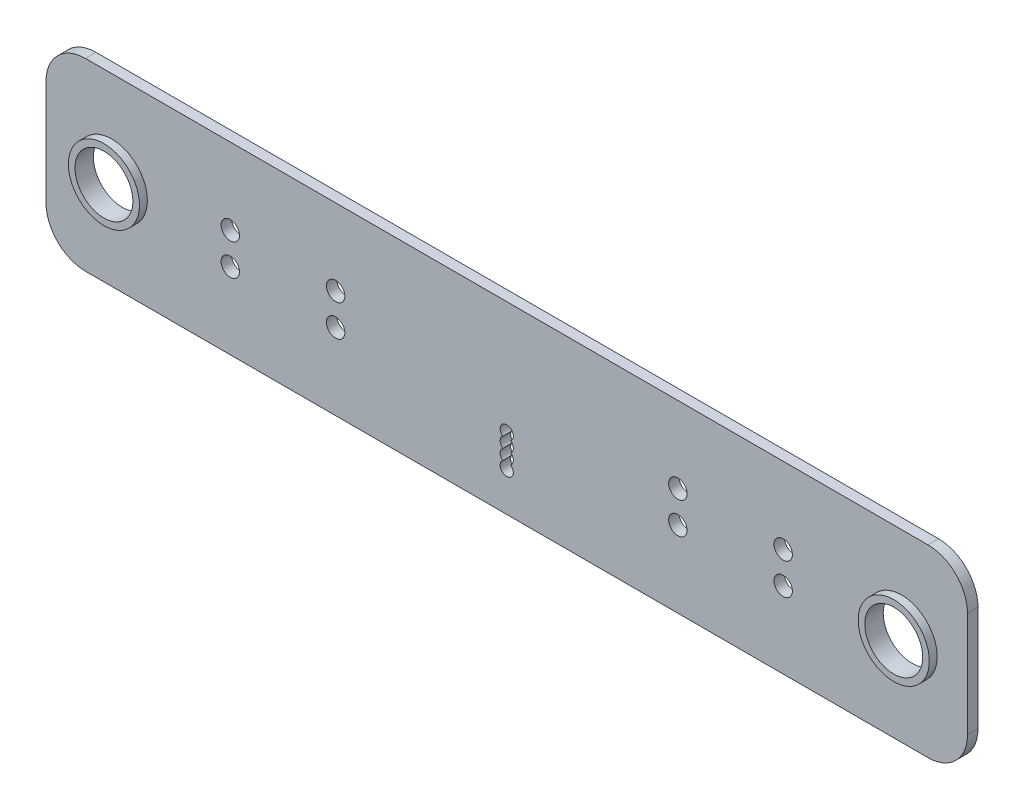
ISO-10303-21;
HEADER;
FILE_DESCRIPTION(('STEP AP214'),'2;1');
FILE_NAME('part.step','',(''),(''),'','','');
FILE_SCHEMA(('AUTOMOTIVE_DESIGN { 1 0 10303 214 1 1 1 1 }'));
ENDSEC;
DATA;
#1=APPLICATION_CONTEXT('core data for automotive mechanical design processes');
#2=APPLICATION_PROTOCOL_DEFINITION('international standard','automotive_design',2000,#1);
#3=PRODUCT_CONTEXT('',#1,'mechanical');
#4=PRODUCT('Part','Part','',(#3));
#5=PRODUCT_RELATED_PRODUCT_CATEGORY('part','',(#4));
#6=PRODUCT_DEFINITION_FORMATION('','',#4);
#7=PRODUCT_DEFINITION_CONTEXT('part definition',#1,'design');
#8=PRODUCT_DEFINITION('design','',#6,#7);
#9=PRODUCT_DEFINITION_SHAPE('','',#8);
#10=(LENGTH_UNIT() NAMED_UNIT(*) SI_UNIT(.MILLI.,.METRE.));
#11=(NAMED_UNIT(*) PLANE_ANGLE_UNIT() SI_UNIT($,.RADIAN.));
#12=(NAMED_UNIT(*) SI_UNIT($,.STERADIAN.) SOLID_ANGLE_UNIT());
#13=UNCERTAINTY_MEASURE_WITH_UNIT(LENGTH_MEASURE(1.E-05),#10,'distance_accuracy_value','');
#14=(GEOMETRIC_REPRESENTATION_CONTEXT(3) GLOBAL_UNCERTAINTY_ASSIGNED_CONTEXT((#13)) GLOBAL_UNIT_ASSIGNED_CONTEXT((#10,
#11,#12)) REPRESENTATION_CONTEXT('',''));
#15=CARTESIAN_POINT('',(0.,0.,0.));
#16=DIRECTION('',(0.,0.,1.));
#17=DIRECTION('',(1.,0.,0.));
#18=AXIS2_PLACEMENT_3D('',#15,#16,#17);
#19=CARTESIAN_POINT('',(0.,0.,4.));
#20=DIRECTION('',(0.,0.,1.));
#21=DIRECTION('',(1.,0.,0.));
#22=AXIS2_PLACEMENT_3D('',#19,#20,#21);
#23=PLANE('',#22);
#24=CARTESIAN_POINT('',(-150.,0.,4.));
#25=DIRECTION('',(0.,0.,1.));
#26=DIRECTION('',(1.,0.,0.));
#27=AXIS2_PLACEMENT_3D('',#24,#25,#26);
#28=CIRCLE('',#27,13.5);
#29=CARTESIAN_POINT('',(-136.5,0.,4.));
#30=VERTEX_POINT('',#29);
#31=EDGE_CURVE('E397',#30,#30,#28,.T.);
#32=ORIENTED_EDGE('',*,*,#31,.F.);
#33=EDGE_LOOP('',(#32));
#34=FACE_BOUND('',#33,.T.);
#35=CARTESIAN_POINT('',(65.,6.,4.));
#36=DIRECTION('',(0.,0.,1.));
#37=DIRECTION('',(-1.,0.,0.));
#38=AXIS2_PLACEMENT_3D('',#35,#36,#37);
#39=CIRCLE('',#38,3.50000000000001);
#40=CARTESIAN_POINT('',(61.5,6.,4.));
#41=VERTEX_POINT('',#40);
#42=EDGE_CURVE('E270',#41,#41,#39,.T.);
#43=ORIENTED_EDGE('',*,*,#42,.F.);
#44=EDGE_LOOP('',(#43));
#45=FACE_BOUND('',#44,.T.);
#46=CARTESIAN_POINT('',(65.,-6.,4.));
#47=DIRECTION('',(0.,0.,1.));
#48=DIRECTION('',(-1.,0.,0.));
#49=AXIS2_PLACEMENT_3D('',#46,#47,#48);
#50=CIRCLE('',#49,3.50000000000001);
#51=CARTESIAN_POINT('',(61.5,-6.,4.));
#52=VERTEX_POINT('',#51);
#53=EDGE_CURVE('E405',#52,#52,#50,.T.);
#54=ORIENTED_EDGE('',*,*,#53,.F.);
#55=EDGE_LOOP('',(#54));
#56=FACE_BOUND('',#55,.T.);
#57=CARTESIAN_POINT('',(105.,-6.,4.));
#58=DIRECTION('',(0.,0.,1.));
#59=DIRECTION('',(-1.,0.,0.));
#60=AXIS2_PLACEMENT_3D('',#57,#58,#59);
#61=CIRCLE('',#60,3.50000000000001);
#62=CARTESIAN_POINT('',(101.5,-6.,4.));
#63=VERTEX_POINT('',#62);
#64=EDGE_CURVE('E408',#63,#63,#61,.T.);
#65=ORIENTED_EDGE('',*,*,#64,.F.);
#66=EDGE_LOOP('',(#65));
#67=FACE_BOUND('',#66,.T.);
#68=CARTESIAN_POINT('',(105.,6.,4.));
#69=DIRECTION('',(0.,0.,1.));
#70=DIRECTION('',(-1.,0.,0.));
#71=AXIS2_PLACEMENT_3D('',#68,#69,#70);
#72=CIRCLE('',#71,3.50000000000001);
#73=CARTESIAN_POINT('',(101.5,6.,4.));
#74=VERTEX_POINT('',#73);
#75=EDGE_CURVE('E172',#74,#74,#72,.T.);
#76=ORIENTED_EDGE('',*,*,#75,.F.);
#77=EDGE_LOOP('',(#76));
#78=FACE_BOUND('',#77,.T.);
#79=CARTESIAN_POINT('',(-65.,6.,4.));
#80=DIRECTION('',(0.,0.,1.));
#81=DIRECTION('',(1.,0.,0.));
#82=AXIS2_PLACEMENT_3D('',#79,#80,#81);
#83=CIRCLE('',#82,3.50000000000001);
#84=CARTESIAN_POINT('',(-61.5,6.,4.));
#85=VERTEX_POINT('',#84);
#86=EDGE_CURVE('E401',#85,#85,#83,.T.);
#87=ORIENTED_EDGE('',*,*,#86,.F.);
#88=EDGE_LOOP('',(#87));
#89=FACE_BOUND('',#88,.T.);
#90=CARTESIAN_POINT('',(-65.,-6.,4.));
#91=DIRECTION('',(0.,0.,1.));
#92=DIRECTION('',(1.,0.,0.));
#93=AXIS2_PLACEMENT_3D('',#90,#91,#92);
#94=CIRCLE('',#93,3.50000000000001);
#95=CARTESIAN_POINT('',(-61.5,-6.,4.));
#96=VERTEX_POINT('',#95);
#97=EDGE_CURVE('E182',#96,#96,#94,.T.);
#98=ORIENTED_EDGE('',*,*,#97,.F.);
#99=EDGE_LOOP('',(#98));
#100=FACE_BOUND('',#99,.T.);
#101=CARTESIAN_POINT('',(-105.,-6.,4.));
#102=DIRECTION('',(0.,0.,1.));
#103=DIRECTION('',(1.,0.,0.));
#104=AXIS2_PLACEMENT_3D('',#101,#102,#103);
#105=CIRCLE('',#104,3.50000000000001);
#106=CARTESIAN_POINT('',(-101.5,-6.,4.));
#107=VERTEX_POINT('',#106);
#108=EDGE_CURVE('E179',#107,#107,#105,.T.);
#109=ORIENTED_EDGE('',*,*,#108,.F.);
#110=EDGE_LOOP('',(#109));
#111=FACE_BOUND('',#110,.T.);
#112=CARTESIAN_POINT('',(0.,-16.,4.));
#113=DIRECTION('',(0.,0.,1.));
#114=DIRECTION('',(-1.,0.,0.));
#115=AXIS2_PLACEMENT_3D('',#112,#113,#114);
#116=CIRCLE('',#115,2.5);
#117=CARTESIAN_POINT('',(-1.49999999999994,-14.,4.));
#118=VERTEX_POINT('',#117);
#119=CARTESIAN_POINT('',(-1.49999999999998,-18.,4.));
#120=VERTEX_POINT('',#119);
#121=EDGE_CURVE('E54',#118,#120,#116,.T.);
#122=ORIENTED_EDGE('',*,*,#121,.F.);
#123=CARTESIAN_POINT('',(0.,-12.,4.));
#124=DIRECTION('',(0.,0.,1.));
#125=DIRECTION('',(-1.,0.,0.));
#126=AXIS2_PLACEMENT_3D('',#123,#124,#125);
#127=CIRCLE('',#126,2.5);
#128=CARTESIAN_POINT('',(-1.49999999999989,-9.99999999999998,4.));
#129=VERTEX_POINT('',#128);
#130=EDGE_CURVE('E167',#129,#118,#127,.T.);
#131=ORIENTED_EDGE('',*,*,#130,.F.);
#132=CARTESIAN_POINT('',(1.26305651597926E-13,-8.,4.));
#133=DIRECTION('',(0.,0.,1.));
#134=DIRECTION('',(-1.,0.,0.));
#135=AXIS2_PLACEMENT_3D('',#132,#133,#134);
#136=CIRCLE('',#135,2.5);
#137=CARTESIAN_POINT('',(1.50000000000011,-10.,4.));
#138=VERTEX_POINT('',#137);
#139=EDGE_CURVE('E161',#138,#129,#136,.T.);
#140=ORIENTED_EDGE('',*,*,#139,.F.);
#141=CARTESIAN_POINT('',(0.,-12.,4.));
#142=DIRECTION('',(0.,0.,1.));
#143=DIRECTION('',(-1.,0.,0.));
#144=AXIS2_PLACEMENT_3D('',#141,#142,#143);
#145=CIRCLE('',#144,2.5);
#146=CARTESIAN_POINT('',(1.50000000000006,-14.,4.));
#147=VERTEX_POINT('',#146);
#148=EDGE_CURVE('E159',#147,#138,#145,.T.);
#149=ORIENTED_EDGE('',*,*,#148,.F.);
#150=CARTESIAN_POINT('',(0.,-16.,4.));
#151=DIRECTION('',(0.,0.,1.));
#152=DIRECTION('',(-1.,0.,0.));
#153=AXIS2_PLACEMENT_3D('',#150,#151,#152);
#154=CIRCLE('',#153,2.5);
#155=CARTESIAN_POINT('',(1.50000000000002,-18.,4.));
#156=VERTEX_POINT('',#155);
#157=EDGE_CURVE('E143',#156,#147,#154,.T.);
#158=ORIENTED_EDGE('',*,*,#157,.F.);
#159=CARTESIAN_POINT('',(0.,-20.,4.));
#160=DIRECTION('',(0.,0.,1.));
#161=DIRECTION('',(-1.,0.,0.));
#162=AXIS2_PLACEMENT_3D('',#159,#160,#161);
#163=CIRCLE('',#162,2.5);
#164=EDGE_CURVE('E152',#120,#156,#163,.T.);
#165=ORIENTED_EDGE('',*,*,#164,.F.);
#166=EDGE_LOOP('',(#122,#131,#140,#149,#158,#165));
#167=FACE_BOUND('',#166,.T.);
#168=CARTESIAN_POINT('',(-105.,6.,4.));
#169=DIRECTION('',(0.,0.,1.));
#170=DIRECTION('',(1.,0.,0.));
#171=AXIS2_PLACEMENT_3D('',#168,#169,#170);
#172=CIRCLE('',#171,3.50000000000001);
#173=CARTESIAN_POINT('',(-101.5,6.,4.));
#174=VERTEX_POINT('',#173);
#175=EDGE_CURVE('E183',#174,#174,#172,.T.);
#176=ORIENTED_EDGE('',*,*,#175,.F.);
#177=EDGE_LOOP('',(#176));
#178=FACE_BOUND('',#177,.T.);
#179=DIRECTION('',(1.,0.,0.));
#180=VECTOR('',#179,1.);
#181=CARTESIAN_POINT('',(-175.,-35.,4.));
#182=LINE('',#181,#180);
#183=CARTESIAN_POINT('',(-160.,-35.,4.));
#184=VERTEX_POINT('',#183);
#185=CARTESIAN_POINT('',(160.,-35.,4.));
#186=VERTEX_POINT('',#185);
#187=EDGE_CURVE('E204',#184,#186,#182,.T.);
#188=ORIENTED_EDGE('',*,*,#187,.T.);
#189=CARTESIAN_POINT('',(160.,-20.,4.));
#190=DIRECTION('',(0.,0.,1.));
#191=DIRECTION('',(1.,0.,0.));
#192=AXIS2_PLACEMENT_3D('',#189,#190,#191);
#193=CIRCLE('',#192,15.);
#194=CARTESIAN_POINT('',(175.,-20.,4.));
#195=VERTEX_POINT('',#194);
#196=EDGE_CURVE('E241',#186,#195,#193,.T.);
#197=ORIENTED_EDGE('',*,*,#196,.T.);
#198=DIRECTION('',(0.,1.,0.));
#199=VECTOR('',#198,1.);
#200=CARTESIAN_POINT('',(175.,35.,4.));
#201=LINE('',#200,#199);
#202=CARTESIAN_POINT('',(175.,20.,4.));
#203=VERTEX_POINT('',#202);
#204=EDGE_CURVE('E194',#195,#203,#201,.T.);
#205=ORIENTED_EDGE('',*,*,#204,.T.);
#206=CARTESIAN_POINT('',(160.,20.,4.));
#207=DIRECTION('',(0.,0.,1.));
#208=DIRECTION('',(1.,0.,0.));
#209=AXIS2_PLACEMENT_3D('',#206,#207,#208);
#210=CIRCLE('',#209,15.);
#211=CARTESIAN_POINT('',(160.,35.,4.));
#212=VERTEX_POINT('',#211);
#213=EDGE_CURVE('E239',#203,#212,#210,.T.);
#214=ORIENTED_EDGE('',*,*,#213,.T.);
#215=DIRECTION('',(-1.,0.,0.));
#216=VECTOR('',#215,1.);
#217=CARTESIAN_POINT('',(-175.,35.,4.));
#218=LINE('',#217,#216);
#219=CARTESIAN_POINT('',(-160.,35.,4.));
#220=VERTEX_POINT('',#219);
#221=EDGE_CURVE('E197',#212,#220,#218,.T.);
#222=ORIENTED_EDGE('',*,*,#221,.T.);
#223=CARTESIAN_POINT('',(-160.,20.,4.));
#224=DIRECTION('',(0.,0.,1.));
#225=DIRECTION('',(1.,0.,0.));
#226=AXIS2_PLACEMENT_3D('',#223,#224,#225);
#227=CIRCLE('',#226,15.);
#228=CARTESIAN_POINT('',(-175.,20.,4.));
#229=VERTEX_POINT('',#228);
#230=EDGE_CURVE('E235',#220,#229,#227,.T.);
#231=ORIENTED_EDGE('',*,*,#230,.T.);
#232=DIRECTION('',(0.,-1.,0.));
#233=VECTOR('',#232,1.);
#234=CARTESIAN_POINT('',(-175.,35.,4.));
#235=LINE('',#234,#233);
#236=CARTESIAN_POINT('',(-175.,-20.,4.));
#237=VERTEX_POINT('',#236);
#238=EDGE_CURVE('E201',#229,#237,#235,.T.);
#239=ORIENTED_EDGE('',*,*,#238,.T.);
#240=CARTESIAN_POINT('',(-160.,-20.,4.));
#241=DIRECTION('',(0.,0.,1.));
#242=DIRECTION('',(1.,0.,0.));
#243=AXIS2_PLACEMENT_3D('',#240,#241,#242);
#244=CIRCLE('',#243,15.);
#245=EDGE_CURVE('E237',#237,#184,#244,.T.);
#246=ORIENTED_EDGE('',*,*,#245,.T.);
#247=EDGE_LOOP('',(#188,#197,#205,#214,#222,#231,#239,#246));
#248=FACE_BOUND('',#247,.T.);
#249=CARTESIAN_POINT('',(150.,0.,4.));
#250=DIRECTION('',(0.,0.,1.));
#251=DIRECTION('',(1.,0.,0.));
#252=AXIS2_PLACEMENT_3D('',#249,#250,#251);
#253=CIRCLE('',#252,13.5);
#254=CARTESIAN_POINT('',(163.5,0.,4.));
#255=VERTEX_POINT('',#254);
#256=EDGE_CURVE('E386',#255,#255,#253,.T.);
#257=ORIENTED_EDGE('',*,*,#256,.F.);
#258=EDGE_LOOP('',(#257));
#259=FACE_BOUND('',#258,.T.);
#260=ADVANCED_FACE('F37',(#34,#45,#56,#67,#78,#89,#100,#111,#167,#178,#248,#259),#23,.T.);
#261=CARTESIAN_POINT('',(175.,35.,4.));
#262=DIRECTION('',(-1.,0.,0.));
#263=DIRECTION('',(0.,-1.,0.));
#264=AXIS2_PLACEMENT_3D('',#261,#262,#263);
#265=PLANE('',#264);
#266=ORIENTED_EDGE('',*,*,#204,.F.);
#267=DIRECTION('',(0.,0.,-1.));
#268=VECTOR('',#267,1.);
#269=CARTESIAN_POINT('',(175.,-20.,4.));
#270=LINE('',#269,#268);
#271=CARTESIAN_POINT('',(175.,-20.,0.));
#272=VERTEX_POINT('',#271);
#273=EDGE_CURVE('E219',#195,#272,#270,.T.);
#274=ORIENTED_EDGE('',*,*,#273,.T.);
#275=DIRECTION('',(0.,1.,0.));
#276=VECTOR('',#275,1.);
#277=CARTESIAN_POINT('',(175.,35.,0.));
#278=LINE('',#277,#276);
#279=CARTESIAN_POINT('',(175.,20.,0.));
#280=VERTEX_POINT('',#279);
#281=EDGE_CURVE('E193',#272,#280,#278,.T.);
#282=ORIENTED_EDGE('',*,*,#281,.T.);
#283=DIRECTION('',(0.,0.,-1.));
#284=VECTOR('',#283,1.);
#285=CARTESIAN_POINT('',(175.,20.,4.));
#286=LINE('',#285,#284);
#287=EDGE_CURVE('E207',#280,#203,#286,.F.);
#288=ORIENTED_EDGE('',*,*,#287,.T.);
#289=EDGE_LOOP('',(#266,#274,#282,#288));
#290=FACE_BOUND('',#289,.T.);
#291=ADVANCED_FACE('F309',(#290),#265,.F.);
#292=CARTESIAN_POINT('',(-175.,35.,4.));
#293=DIRECTION('',(0.,-1.,0.));
#294=DIRECTION('',(0.,0.,-1.));
#295=AXIS2_PLACEMENT_3D('',#292,#293,#294);
#296=PLANE('',#295);
#297=ORIENTED_EDGE('',*,*,#221,.F.);
#298=DIRECTION('',(0.,0.,-1.));
#299=VECTOR('',#298,1.);
#300=CARTESIAN_POINT('',(160.,35.,4.));
#301=LINE('',#300,#299);
#302=CARTESIAN_POINT('',(160.,35.,0.));
#303=VERTEX_POINT('',#302);
#304=EDGE_CURVE('E245',#212,#303,#301,.T.);
#305=ORIENTED_EDGE('',*,*,#304,.T.);
#306=DIRECTION('',(-1.,0.,0.));
#307=VECTOR('',#306,1.);
#308=CARTESIAN_POINT('',(-175.,35.,0.));
#309=LINE('',#308,#307);
#310=CARTESIAN_POINT('',(-160.,35.,0.));
#311=VERTEX_POINT('',#310);
#312=EDGE_CURVE('E210',#303,#311,#309,.T.);
#313=ORIENTED_EDGE('',*,*,#312,.T.);
#314=DIRECTION('',(0.,0.,-1.));
#315=VECTOR('',#314,1.);
#316=CARTESIAN_POINT('',(-160.,35.,4.));
#317=LINE('',#316,#315);
#318=EDGE_CURVE('E243',#311,#220,#317,.F.);
#319=ORIENTED_EDGE('',*,*,#318,.T.);
#320=EDGE_LOOP('',(#297,#305,#313,#319));
#321=FACE_BOUND('',#320,.T.);
#322=ADVANCED_FACE('F315',(#321),#296,.F.);
#323=CARTESIAN_POINT('',(-175.,35.,4.));
#324=DIRECTION('',(1.,0.,0.));
#325=DIRECTION('',(0.,0.,-1.));
#326=AXIS2_PLACEMENT_3D('',#323,#324,#325);
#327=PLANE('',#326);
#328=DIRECTION('',(0.,-1.,0.));
#329=VECTOR('',#328,1.);
#330=CARTESIAN_POINT('',(-175.,35.,0.));
#331=LINE('',#330,#329);
#332=CARTESIAN_POINT('',(-175.,20.,0.));
#333=VERTEX_POINT('',#332);
#334=CARTESIAN_POINT('',(-175.,-20.,0.));
#335=VERTEX_POINT('',#334);
#336=EDGE_CURVE('E213',#333,#335,#331,.T.);
#337=ORIENTED_EDGE('',*,*,#336,.T.);
#338=DIRECTION('',(0.,0.,-1.));
#339=VECTOR('',#338,1.);
#340=CARTESIAN_POINT('',(-175.,-20.,4.));
#341=LINE('',#340,#339);
#342=EDGE_CURVE('E251',#335,#237,#341,.F.);
#343=ORIENTED_EDGE('',*,*,#342,.T.);
#344=ORIENTED_EDGE('',*,*,#238,.F.);
#345=DIRECTION('',(0.,0.,-1.));
#346=VECTOR('',#345,1.);
#347=CARTESIAN_POINT('',(-175.,20.,4.));
#348=LINE('',#347,#346);
#349=EDGE_CURVE('E248',#229,#333,#348,.T.);
#350=ORIENTED_EDGE('',*,*,#349,.T.);
#351=EDGE_LOOP('',(#337,#343,#344,#350));
#352=FACE_BOUND('',#351,.T.);
#353=ADVANCED_FACE('F330',(#352),#327,.F.);
#354=CARTESIAN_POINT('',(-175.,-35.,4.));
#355=DIRECTION('',(0.,1.,0.));
#356=DIRECTION('',(0.,0.,1.));
#357=AXIS2_PLACEMENT_3D('',#354,#355,#356);
#358=PLANE('',#357);
#359=DIRECTION('',(1.,0.,0.));
#360=VECTOR('',#359,1.);
#361=CARTESIAN_POINT('',(-175.,-35.,0.));
#362=LINE('',#361,#360);
#363=CARTESIAN_POINT('',(-160.,-35.,0.));
#364=VERTEX_POINT('',#363);
#365=CARTESIAN_POINT('',(160.,-35.,0.));
#366=VERTEX_POINT('',#365);
#367=EDGE_CURVE('E198',#364,#366,#362,.T.);
#368=ORIENTED_EDGE('',*,*,#367,.T.);
#369=DIRECTION('',(0.,0.,-1.));
#370=VECTOR('',#369,1.);
#371=CARTESIAN_POINT('',(160.,-35.,4.));
#372=LINE('',#371,#370);
#373=EDGE_CURVE('E233',#366,#186,#372,.F.);
#374=ORIENTED_EDGE('',*,*,#373,.T.);
#375=ORIENTED_EDGE('',*,*,#187,.F.);
#376=DIRECTION('',(0.,0.,-1.));
#377=VECTOR('',#376,1.);
#378=CARTESIAN_POINT('',(-160.,-35.,4.));
#379=LINE('',#378,#377);
#380=EDGE_CURVE('E230',#184,#364,#379,.T.);
#381=ORIENTED_EDGE('',*,*,#380,.T.);
#382=EDGE_LOOP('',(#368,#374,#375,#381));
#383=FACE_BOUND('',#382,.T.);
#384=ADVANCED_FACE('F327',(#383),#358,.F.);
#385=CARTESIAN_POINT('',(0.,0.,0.));
#386=DIRECTION('',(0.,0.,1.));
#387=DIRECTION('',(1.,0.,0.));
#388=AXIS2_PLACEMENT_3D('',#385,#386,#387);
#389=PLANE('',#388);
#390=CARTESIAN_POINT('',(65.,6.,0.));
#391=DIRECTION('',(0.,0.,1.));
#392=DIRECTION('',(1.,0.,0.));
#393=AXIS2_PLACEMENT_3D('',#390,#391,#392);
#394=CIRCLE('',#393,3.50000000000001);
#395=CARTESIAN_POINT('',(68.5,6.,0.));
#396=VERTEX_POINT('',#395);
#397=EDGE_CURVE('E41',#396,#396,#394,.T.);
#398=ORIENTED_EDGE('',*,*,#397,.T.);
#399=EDGE_LOOP('',(#398));
#400=FACE_BOUND('',#399,.T.);
#401=CARTESIAN_POINT('',(65.,-6.,0.));
#402=DIRECTION('',(0.,0.,1.));
#403=DIRECTION('',(1.,0.,0.));
#404=AXIS2_PLACEMENT_3D('',#401,#402,#403);
#405=CIRCLE('',#404,3.50000000000001);
#406=CARTESIAN_POINT('',(68.5,-6.,0.));
#407=VERTEX_POINT('',#406);
#408=EDGE_CURVE('E281',#407,#407,#405,.T.);
#409=ORIENTED_EDGE('',*,*,#408,.T.);
#410=EDGE_LOOP('',(#409));
#411=FACE_BOUND('',#410,.T.);
#412=CARTESIAN_POINT('',(105.,-6.,0.));
#413=DIRECTION('',(0.,0.,1.));
#414=DIRECTION('',(1.,0.,0.));
#415=AXIS2_PLACEMENT_3D('',#412,#413,#414);
#416=CIRCLE('',#415,3.50000000000001);
#417=CARTESIAN_POINT('',(108.5,-6.,0.));
#418=VERTEX_POINT('',#417);
#419=EDGE_CURVE('E279',#418,#418,#416,.T.);
#420=ORIENTED_EDGE('',*,*,#419,.T.);
#421=EDGE_LOOP('',(#420));
#422=FACE_BOUND('',#421,.T.);
#423=CARTESIAN_POINT('',(105.,6.,0.));
#424=DIRECTION('',(0.,0.,1.));
#425=DIRECTION('',(1.,0.,0.));
#426=AXIS2_PLACEMENT_3D('',#423,#424,#425);
#427=CIRCLE('',#426,3.50000000000001);
#428=CARTESIAN_POINT('',(108.5,6.,0.));
#429=VERTEX_POINT('',#428);
#430=EDGE_CURVE('E276',#429,#429,#427,.T.);
#431=ORIENTED_EDGE('',*,*,#430,.T.);
#432=EDGE_LOOP('',(#431));
#433=FACE_BOUND('',#432,.T.);
#434=CARTESIAN_POINT('',(-65.,6.,0.));
#435=DIRECTION('',(0.,0.,1.));
#436=DIRECTION('',(1.,0.,0.));
#437=AXIS2_PLACEMENT_3D('',#434,#435,#436);
#438=CIRCLE('',#437,3.50000000000001);
#439=CARTESIAN_POINT('',(-61.5,6.,0.));
#440=VERTEX_POINT('',#439);
#441=EDGE_CURVE('E273',#440,#440,#438,.T.);
#442=ORIENTED_EDGE('',*,*,#441,.T.);
#443=EDGE_LOOP('',(#442));
#444=FACE_BOUND('',#443,.T.);
#445=CARTESIAN_POINT('',(-65.,-6.,0.));
#446=DIRECTION('',(0.,0.,1.));
#447=DIRECTION('',(1.,0.,0.));
#448=AXIS2_PLACEMENT_3D('',#445,#446,#447);
#449=CIRCLE('',#448,3.50000000000001);
#450=CARTESIAN_POINT('',(-61.5,-6.,0.));
#451=VERTEX_POINT('',#450);
#452=EDGE_CURVE('E269',#451,#451,#449,.T.);
#453=ORIENTED_EDGE('',*,*,#452,.T.);
#454=EDGE_LOOP('',(#453));
#455=FACE_BOUND('',#454,.T.);
#456=CARTESIAN_POINT('',(-105.,-6.,0.));
#457=DIRECTION('',(0.,0.,1.));
#458=DIRECTION('',(1.,0.,0.));
#459=AXIS2_PLACEMENT_3D('',#456,#457,#458);
#460=CIRCLE('',#459,3.50000000000001);
#461=CARTESIAN_POINT('',(-101.5,-6.,0.));
#462=VERTEX_POINT('',#461);
#463=EDGE_CURVE('E266',#462,#462,#460,.T.);
#464=ORIENTED_EDGE('',*,*,#463,.T.);
#465=EDGE_LOOP('',(#464));
#466=FACE_BOUND('',#465,.T.);
#467=CARTESIAN_POINT('',(0.,-12.,0.));
#468=DIRECTION('',(0.,0.,1.));
#469=DIRECTION('',(1.,0.,0.));
#470=AXIS2_PLACEMENT_3D('',#467,#468,#469);
#471=CIRCLE('',#470,2.5);
#472=CARTESIAN_POINT('',(-1.49999999999989,-9.99999999999998,0.));
#473=VERTEX_POINT('',#472);
#474=CARTESIAN_POINT('',(-1.49999999999994,-14.,0.));
#475=VERTEX_POINT('',#474);
#476=EDGE_CURVE('E46',#473,#475,#471,.T.);
#477=ORIENTED_EDGE('',*,*,#476,.T.);
#478=CARTESIAN_POINT('',(0.,-16.,0.));
#479=DIRECTION('',(0.,0.,1.));
#480=DIRECTION('',(1.,0.,0.));
#481=AXIS2_PLACEMENT_3D('',#478,#479,#480);
#482=CIRCLE('',#481,2.5);
#483=CARTESIAN_POINT('',(-1.49999999999998,-18.,0.));
#484=VERTEX_POINT('',#483);
#485=EDGE_CURVE('E11',#475,#484,#482,.T.);
#486=ORIENTED_EDGE('',*,*,#485,.T.);
#487=CARTESIAN_POINT('',(0.,-20.,0.));
#488=DIRECTION('',(0.,0.,1.));
#489=DIRECTION('',(1.,0.,0.));
#490=AXIS2_PLACEMENT_3D('',#487,#488,#489);
#491=CIRCLE('',#490,2.5);
#492=CARTESIAN_POINT('',(1.50000000000002,-18.,0.));
#493=VERTEX_POINT('',#492);
#494=EDGE_CURVE('E253',#484,#493,#491,.T.);
#495=ORIENTED_EDGE('',*,*,#494,.T.);
#496=CARTESIAN_POINT('',(0.,-16.,0.));
#497=DIRECTION('',(0.,0.,1.));
#498=DIRECTION('',(1.,0.,0.));
#499=AXIS2_PLACEMENT_3D('',#496,#497,#498);
#500=CIRCLE('',#499,2.5);
#501=CARTESIAN_POINT('',(1.50000000000006,-14.,0.));
#502=VERTEX_POINT('',#501);
#503=EDGE_CURVE('E146',#493,#502,#500,.T.);
#504=ORIENTED_EDGE('',*,*,#503,.T.);
#505=CARTESIAN_POINT('',(0.,-12.,0.));
#506=DIRECTION('',(0.,0.,1.));
#507=DIRECTION('',(1.,0.,0.));
#508=AXIS2_PLACEMENT_3D('',#505,#506,#507);
#509=CIRCLE('',#508,2.5);
#510=CARTESIAN_POINT('',(1.50000000000011,-10.,0.));
#511=VERTEX_POINT('',#510);
#512=EDGE_CURVE('E258',#502,#511,#509,.T.);
#513=ORIENTED_EDGE('',*,*,#512,.T.);
#514=CARTESIAN_POINT('',(1.26305651597926E-13,-8.,0.));
#515=DIRECTION('',(0.,0.,1.));
#516=DIRECTION('',(1.,0.,0.));
#517=AXIS2_PLACEMENT_3D('',#514,#515,#516);
#518=CIRCLE('',#517,2.5);
#519=EDGE_CURVE('E261',#511,#473,#518,.T.);
#520=ORIENTED_EDGE('',*,*,#519,.T.);
#521=EDGE_LOOP('',(#477,#486,#495,#504,#513,#520));
#522=FACE_BOUND('',#521,.T.);
#523=CARTESIAN_POINT('',(-105.,6.,0.));
#524=DIRECTION('',(0.,0.,1.));
#525=DIRECTION('',(1.,0.,0.));
#526=AXIS2_PLACEMENT_3D('',#523,#524,#525);
#527=CIRCLE('',#526,3.50000000000001);
#528=CARTESIAN_POINT('',(-101.5,6.,0.));
#529=VERTEX_POINT('',#528);
#530=EDGE_CURVE('E186',#529,#529,#527,.T.);
#531=ORIENTED_EDGE('',*,*,#530,.T.);
#532=EDGE_LOOP('',(#531));
#533=FACE_BOUND('',#532,.T.);
#534=ORIENTED_EDGE('',*,*,#281,.F.);
#535=CARTESIAN_POINT('',(160.,-20.,0.));
#536=DIRECTION('',(0.,0.,1.));
#537=DIRECTION('',(1.,0.,0.));
#538=AXIS2_PLACEMENT_3D('',#535,#536,#537);
#539=CIRCLE('',#538,15.);
#540=EDGE_CURVE('E228',#272,#366,#539,.F.);
#541=ORIENTED_EDGE('',*,*,#540,.T.);
#542=ORIENTED_EDGE('',*,*,#367,.F.);
#543=CARTESIAN_POINT('',(-160.,-20.,0.));
#544=DIRECTION('',(0.,0.,1.));
#545=DIRECTION('',(1.,0.,0.));
#546=AXIS2_PLACEMENT_3D('',#543,#544,#545);
#547=CIRCLE('',#546,15.);
#548=EDGE_CURVE('E224',#364,#335,#547,.F.);
#549=ORIENTED_EDGE('',*,*,#548,.T.);
#550=ORIENTED_EDGE('',*,*,#336,.F.);
#551=CARTESIAN_POINT('',(-160.,20.,0.));
#552=DIRECTION('',(0.,0.,1.));
#553=DIRECTION('',(1.,0.,0.));
#554=AXIS2_PLACEMENT_3D('',#551,#552,#553);
#555=CIRCLE('',#554,15.);
#556=EDGE_CURVE('E222',#333,#311,#555,.F.);
#557=ORIENTED_EDGE('',*,*,#556,.T.);
#558=ORIENTED_EDGE('',*,*,#312,.F.);
#559=CARTESIAN_POINT('',(160.,20.,0.));
#560=DIRECTION('',(0.,0.,1.));
#561=DIRECTION('',(1.,0.,0.));
#562=AXIS2_PLACEMENT_3D('',#559,#560,#561);
#563=CIRCLE('',#562,15.);
#564=EDGE_CURVE('E226',#303,#280,#563,.F.);
#565=ORIENTED_EDGE('',*,*,#564,.T.);
#566=EDGE_LOOP('',(#534,#541,#542,#549,#550,#557,#558,#565));
#567=FACE_BOUND('',#566,.T.);
#568=CARTESIAN_POINT('',(-150.,0.,0.));
#569=DIRECTION('',(0.,0.,1.));
#570=DIRECTION('',(1.,0.,0.));
#571=AXIS2_PLACEMENT_3D('',#568,#569,#570);
#572=CIRCLE('',#571,11.);
#573=CARTESIAN_POINT('',(-139.,0.,0.));
#574=VERTEX_POINT('',#573);
#575=EDGE_CURVE('E187',#574,#574,#572,.T.);
#576=ORIENTED_EDGE('',*,*,#575,.T.);
#577=EDGE_LOOP('',(#576));
#578=FACE_BOUND('',#577,.T.);
#579=CARTESIAN_POINT('',(150.,0.,0.));
#580=DIRECTION('',(0.,0.,-1.));
#581=DIRECTION('',(-1.,0.,0.));
#582=AXIS2_PLACEMENT_3D('',#579,#580,#581);
#583=CIRCLE('',#582,11.);
#584=CARTESIAN_POINT('',(139.,0.,0.));
#585=VERTEX_POINT('',#584);
#586=EDGE_CURVE('E190',#585,#585,#583,.T.);
#587=ORIENTED_EDGE('',*,*,#586,.F.);
#588=EDGE_LOOP('',(#587));
#589=FACE_BOUND('',#588,.T.);
#590=ADVANCED_FACE('F288',(#400,#411,#422,#433,#444,#455,#466,#522,#533,#567,#578,#589),#389,.F.);
#591=CARTESIAN_POINT('',(160.,-20.,4.));
#592=DIRECTION('',(0.,0.,-1.));
#593=DIRECTION('',(-1.,0.,0.));
#594=AXIS2_PLACEMENT_3D('',#591,#592,#593);
#595=CYLINDRICAL_SURFACE('',#594,15.);
#596=ORIENTED_EDGE('',*,*,#196,.F.);
#597=ORIENTED_EDGE('',*,*,#373,.F.);
#598=ORIENTED_EDGE('',*,*,#540,.F.);
#599=ORIENTED_EDGE('',*,*,#273,.F.);
#600=EDGE_LOOP('',(#596,#597,#598,#599));
#601=FACE_BOUND('',#600,.T.);
#602=ADVANCED_FACE('F326',(#601),#595,.T.);
#603=CARTESIAN_POINT('',(160.,20.,4.));
#604=DIRECTION('',(0.,0.,-1.));
#605=DIRECTION('',(-1.,0.,0.));
#606=AXIS2_PLACEMENT_3D('',#603,#604,#605);
#607=CYLINDRICAL_SURFACE('',#606,15.);
#608=ORIENTED_EDGE('',*,*,#213,.F.);
#609=ORIENTED_EDGE('',*,*,#287,.F.);
#610=ORIENTED_EDGE('',*,*,#564,.F.);
#611=ORIENTED_EDGE('',*,*,#304,.F.);
#612=EDGE_LOOP('',(#608,#609,#610,#611));
#613=FACE_BOUND('',#612,.T.);
#614=ADVANCED_FACE('F340',(#613),#607,.T.);
#615=CARTESIAN_POINT('',(-160.,-20.,4.));
#616=DIRECTION('',(0.,0.,-1.));
#617=DIRECTION('',(-1.,0.,0.));
#618=AXIS2_PLACEMENT_3D('',#615,#616,#617);
#619=CYLINDRICAL_SURFACE('',#618,15.);
#620=ORIENTED_EDGE('',*,*,#245,.F.);
#621=ORIENTED_EDGE('',*,*,#342,.F.);
#622=ORIENTED_EDGE('',*,*,#548,.F.);
#623=ORIENTED_EDGE('',*,*,#380,.F.);
#624=EDGE_LOOP('',(#620,#621,#622,#623));
#625=FACE_BOUND('',#624,.T.);
#626=ADVANCED_FACE('F343',(#625),#619,.T.);
#627=CARTESIAN_POINT('',(-160.,20.,4.));
#628=DIRECTION('',(0.,0.,-1.));
#629=DIRECTION('',(-1.,0.,0.));
#630=AXIS2_PLACEMENT_3D('',#627,#628,#629);
#631=CYLINDRICAL_SURFACE('',#630,15.);
#632=ORIENTED_EDGE('',*,*,#230,.F.);
#633=ORIENTED_EDGE('',*,*,#318,.F.);
#634=ORIENTED_EDGE('',*,*,#556,.F.);
#635=ORIENTED_EDGE('',*,*,#349,.F.);
#636=EDGE_LOOP('',(#632,#633,#634,#635));
#637=FACE_BOUND('',#636,.T.);
#638=ADVANCED_FACE('F39',(#637),#631,.T.);
#639=CARTESIAN_POINT('',(150.,0.,10.));
#640=DIRECTION('',(0.,0.,-1.));
#641=DIRECTION('',(-1.,0.,0.));
#642=AXIS2_PLACEMENT_3D('',#639,#640,#641);
#643=CYLINDRICAL_SURFACE('',#642,11.);
#644=ORIENTED_EDGE('',*,*,#586,.T.);
#645=EDGE_LOOP('',(#644));
#646=FACE_BOUND('',#645,.T.);
#647=CARTESIAN_POINT('',(150.,0.,7.));
#648=DIRECTION('',(0.,0.,1.));
#649=DIRECTION('',(1.,0.,0.));
#650=AXIS2_PLACEMENT_3D('',#647,#648,#649);
#651=CIRCLE('',#650,11.);
#652=CARTESIAN_POINT('',(161.,0.,7.));
#653=VERTEX_POINT('',#652);
#654=EDGE_CURVE('E384',#653,#653,#651,.T.);
#655=ORIENTED_EDGE('',*,*,#654,.T.);
#656=EDGE_LOOP('',(#655));
#657=FACE_BOUND('',#656,.T.);
#658=ADVANCED_FACE('F322',(#646,#657),#643,.F.);
#659=CARTESIAN_POINT('',(-150.,0.,10.));
#660=DIRECTION('',(0.,0.,-1.));
#661=DIRECTION('',(-1.,0.,0.));
#662=AXIS2_PLACEMENT_3D('',#659,#660,#661);
#663=CYLINDRICAL_SURFACE('',#662,11.);
#664=ORIENTED_EDGE('',*,*,#575,.F.);
#665=EDGE_LOOP('',(#664));
#666=FACE_BOUND('',#665,.T.);
#667=CARTESIAN_POINT('',(-150.,0.,7.));
#668=DIRECTION('',(0.,0.,1.));
#669=DIRECTION('',(1.,0.,0.));
#670=AXIS2_PLACEMENT_3D('',#667,#668,#669);
#671=CIRCLE('',#670,11.);
#672=CARTESIAN_POINT('',(-139.,0.,7.));
#673=VERTEX_POINT('',#672);
#674=EDGE_CURVE('E393',#673,#673,#671,.T.);
#675=ORIENTED_EDGE('',*,*,#674,.T.);
#676=EDGE_LOOP('',(#675));
#677=FACE_BOUND('',#676,.T.);
#678=ADVANCED_FACE('F381',(#666,#677),#663,.F.);
#679=CARTESIAN_POINT('',(-105.,6.,-6.));
#680=DIRECTION('',(0.,0.,1.));
#681=DIRECTION('',(1.,0.,0.));
#682=AXIS2_PLACEMENT_3D('',#679,#680,#681);
#683=CYLINDRICAL_SURFACE('',#682,3.50000000000001);
#684=ORIENTED_EDGE('',*,*,#175,.T.);
#685=EDGE_LOOP('',(#684));
#686=FACE_BOUND('',#685,.T.);
#687=ORIENTED_EDGE('',*,*,#530,.F.);
#688=EDGE_LOOP('',(#687));
#689=FACE_BOUND('',#688,.T.);
#690=ADVANCED_FACE('F437',(#686,#689),#683,.F.);
#691=CARTESIAN_POINT('',(0.,-16.,-6.));
#692=DIRECTION('',(0.,0.,1.));
#693=DIRECTION('',(1.,0.,0.));
#694=AXIS2_PLACEMENT_3D('',#691,#692,#693);
#695=CYLINDRICAL_SURFACE('',#694,2.5);
#696=DIRECTION('',(0.,0.,1.));
#697=VECTOR('',#696,1.);
#698=CARTESIAN_POINT('',(-1.49999999999994,-14.,-6.));
#699=LINE('',#698,#697);
#700=EDGE_CURVE('E170',#475,#118,#699,.T.);
#701=ORIENTED_EDGE('',*,*,#700,.T.);
#702=ORIENTED_EDGE('',*,*,#121,.T.);
#703=DIRECTION('',(0.,0.,1.));
#704=VECTOR('',#703,1.);
#705=CARTESIAN_POINT('',(-1.49999999999998,-18.,-6.));
#706=LINE('',#705,#704);
#707=EDGE_CURVE('E149',#484,#120,#706,.T.);
#708=ORIENTED_EDGE('',*,*,#707,.F.);
#709=ORIENTED_EDGE('',*,*,#485,.F.);
#710=EDGE_LOOP('',(#701,#702,#708,#709));
#711=FACE_BOUND('',#710,.T.);
#712=ADVANCED_FACE('F439',(#711),#695,.F.);
#713=CARTESIAN_POINT('',(0.,-12.,-6.));
#714=DIRECTION('',(0.,0.,1.));
#715=DIRECTION('',(1.,0.,0.));
#716=AXIS2_PLACEMENT_3D('',#713,#714,#715);
#717=CYLINDRICAL_SURFACE('',#716,2.5);
#718=DIRECTION('',(0.,0.,1.));
#719=VECTOR('',#718,1.);
#720=CARTESIAN_POINT('',(-1.49999999999989,-9.99999999999998,-6.));
#721=LINE('',#720,#719);
#722=EDGE_CURVE('E173',#473,#129,#721,.T.);
#723=ORIENTED_EDGE('',*,*,#722,.T.);
#724=ORIENTED_EDGE('',*,*,#130,.T.);
#725=ORIENTED_EDGE('',*,*,#700,.F.);
#726=ORIENTED_EDGE('',*,*,#476,.F.);
#727=EDGE_LOOP('',(#723,#724,#725,#726));
#728=FACE_BOUND('',#727,.T.);
#729=ADVANCED_FACE('F446',(#728),#717,.F.);
#730=CARTESIAN_POINT('',(1.26305651597926E-13,-8.,-6.));
#731=DIRECTION('',(0.,0.,1.));
#732=DIRECTION('',(1.,0.,0.));
#733=AXIS2_PLACEMENT_3D('',#730,#731,#732);
#734=CYLINDRICAL_SURFACE('',#733,2.5);
#735=DIRECTION('',(0.,0.,1.));
#736=VECTOR('',#735,1.);
#737=CARTESIAN_POINT('',(1.50000000000011,-10.,-6.));
#738=LINE('',#737,#736);
#739=EDGE_CURVE('E175',#511,#138,#738,.T.);
#740=ORIENTED_EDGE('',*,*,#739,.T.);
#741=ORIENTED_EDGE('',*,*,#139,.T.);
#742=ORIENTED_EDGE('',*,*,#722,.F.);
#743=ORIENTED_EDGE('',*,*,#519,.F.);
#744=EDGE_LOOP('',(#740,#741,#742,#743));
#745=FACE_BOUND('',#744,.T.);
#746=ADVANCED_FACE('F457',(#745),#734,.F.);
#747=CARTESIAN_POINT('',(0.,-12.,-6.));
#748=DIRECTION('',(0.,0.,1.));
#749=DIRECTION('',(1.,0.,0.));
#750=AXIS2_PLACEMENT_3D('',#747,#748,#749);
#751=CYLINDRICAL_SURFACE('',#750,2.5);
#752=DIRECTION('',(0.,0.,1.));
#753=VECTOR('',#752,1.);
#754=CARTESIAN_POINT('',(1.50000000000006,-14.,-6.));
#755=LINE('',#754,#753);
#756=EDGE_CURVE('E148',#502,#147,#755,.T.);
#757=ORIENTED_EDGE('',*,*,#756,.T.);
#758=ORIENTED_EDGE('',*,*,#148,.T.);
#759=ORIENTED_EDGE('',*,*,#739,.F.);
#760=ORIENTED_EDGE('',*,*,#512,.F.);
#761=EDGE_LOOP('',(#757,#758,#759,#760));
#762=FACE_BOUND('',#761,.T.);
#763=ADVANCED_FACE('F454',(#762),#751,.F.);
#764=CARTESIAN_POINT('',(0.,-16.,-6.));
#765=DIRECTION('',(0.,0.,1.));
#766=DIRECTION('',(1.,0.,0.));
#767=AXIS2_PLACEMENT_3D('',#764,#765,#766);
#768=CYLINDRICAL_SURFACE('',#767,2.5);
#769=DIRECTION('',(0.,0.,1.));
#770=VECTOR('',#769,1.);
#771=CARTESIAN_POINT('',(1.50000000000002,-18.,-6.));
#772=LINE('',#771,#770);
#773=EDGE_CURVE('E62',#493,#156,#772,.T.);
#774=ORIENTED_EDGE('',*,*,#773,.T.);
#775=ORIENTED_EDGE('',*,*,#157,.T.);
#776=ORIENTED_EDGE('',*,*,#756,.F.);
#777=ORIENTED_EDGE('',*,*,#503,.F.);
#778=EDGE_LOOP('',(#774,#775,#776,#777));
#779=FACE_BOUND('',#778,.T.);
#780=ADVANCED_FACE('F140',(#779),#768,.F.);
#781=CARTESIAN_POINT('',(0.,-20.,-6.));
#782=DIRECTION('',(0.,0.,1.));
#783=DIRECTION('',(1.,0.,0.));
#784=AXIS2_PLACEMENT_3D('',#781,#782,#783);
#785=CYLINDRICAL_SURFACE('',#784,2.5);
#786=ORIENTED_EDGE('',*,*,#707,.T.);
#787=ORIENTED_EDGE('',*,*,#164,.T.);
#788=ORIENTED_EDGE('',*,*,#773,.F.);
#789=ORIENTED_EDGE('',*,*,#494,.F.);
#790=EDGE_LOOP('',(#786,#787,#788,#789));
#791=FACE_BOUND('',#790,.T.);
#792=ADVANCED_FACE('F153',(#791),#785,.F.);
#793=CARTESIAN_POINT('',(-105.,-6.,-6.));
#794=DIRECTION('',(0.,0.,1.));
#795=DIRECTION('',(1.,0.,0.));
#796=AXIS2_PLACEMENT_3D('',#793,#794,#795);
#797=CYLINDRICAL_SURFACE('',#796,3.50000000000001);
#798=ORIENTED_EDGE('',*,*,#108,.T.);
#799=EDGE_LOOP('',(#798));
#800=FACE_BOUND('',#799,.T.);
#801=ORIENTED_EDGE('',*,*,#463,.F.);
#802=EDGE_LOOP('',(#801));
#803=FACE_BOUND('',#802,.T.);
#804=ADVANCED_FACE('F426',(#800,#803),#797,.F.);
#805=CARTESIAN_POINT('',(-65.,-6.,-6.));
#806=DIRECTION('',(0.,0.,1.));
#807=DIRECTION('',(1.,0.,0.));
#808=AXIS2_PLACEMENT_3D('',#805,#806,#807);
#809=CYLINDRICAL_SURFACE('',#808,3.50000000000001);
#810=ORIENTED_EDGE('',*,*,#97,.T.);
#811=EDGE_LOOP('',(#810));
#812=FACE_BOUND('',#811,.T.);
#813=ORIENTED_EDGE('',*,*,#452,.F.);
#814=EDGE_LOOP('',(#813));
#815=FACE_BOUND('',#814,.T.);
#816=ADVANCED_FACE('F429',(#812,#815),#809,.F.);
#817=CARTESIAN_POINT('',(-65.,6.,-6.));
#818=DIRECTION('',(0.,0.,1.));
#819=DIRECTION('',(1.,0.,0.));
#820=AXIS2_PLACEMENT_3D('',#817,#818,#819);
#821=CYLINDRICAL_SURFACE('',#820,3.50000000000001);
#822=ORIENTED_EDGE('',*,*,#86,.T.);
#823=EDGE_LOOP('',(#822));
#824=FACE_BOUND('',#823,.T.);
#825=ORIENTED_EDGE('',*,*,#441,.F.);
#826=EDGE_LOOP('',(#825));
#827=FACE_BOUND('',#826,.T.);
#828=ADVANCED_FACE('F418',(#824,#827),#821,.F.);
#829=CARTESIAN_POINT('',(105.,6.,-6.));
#830=DIRECTION('',(0.,0.,1.));
#831=DIRECTION('',(1.,0.,0.));
#832=AXIS2_PLACEMENT_3D('',#829,#830,#831);
#833=CYLINDRICAL_SURFACE('',#832,3.50000000000001);
#834=ORIENTED_EDGE('',*,*,#75,.T.);
#835=EDGE_LOOP('',(#834));
#836=FACE_BOUND('',#835,.T.);
#837=ORIENTED_EDGE('',*,*,#430,.F.);
#838=EDGE_LOOP('',(#837));
#839=FACE_BOUND('',#838,.T.);
#840=ADVANCED_FACE('F467',(#836,#839),#833,.F.);
#841=CARTESIAN_POINT('',(105.,-6.,-6.));
#842=DIRECTION('',(0.,0.,1.));
#843=DIRECTION('',(1.,0.,0.));
#844=AXIS2_PLACEMENT_3D('',#841,#842,#843);
#845=CYLINDRICAL_SURFACE('',#844,3.50000000000001);
#846=ORIENTED_EDGE('',*,*,#64,.T.);
#847=EDGE_LOOP('',(#846));
#848=FACE_BOUND('',#847,.T.);
#849=ORIENTED_EDGE('',*,*,#419,.F.);
#850=EDGE_LOOP('',(#849));
#851=FACE_BOUND('',#850,.T.);
#852=ADVANCED_FACE('F303',(#848,#851),#845,.F.);
#853=CARTESIAN_POINT('',(65.,-6.,-6.));
#854=DIRECTION('',(0.,0.,1.));
#855=DIRECTION('',(1.,0.,0.));
#856=AXIS2_PLACEMENT_3D('',#853,#854,#855);
#857=CYLINDRICAL_SURFACE('',#856,3.50000000000001);
#858=ORIENTED_EDGE('',*,*,#53,.T.);
#859=EDGE_LOOP('',(#858));
#860=FACE_BOUND('',#859,.T.);
#861=ORIENTED_EDGE('',*,*,#408,.F.);
#862=EDGE_LOOP('',(#861));
#863=FACE_BOUND('',#862,.T.);
#864=ADVANCED_FACE('F293',(#860,#863),#857,.F.);
#865=CARTESIAN_POINT('',(65.,6.,-6.));
#866=DIRECTION('',(0.,0.,1.));
#867=DIRECTION('',(1.,0.,0.));
#868=AXIS2_PLACEMENT_3D('',#865,#866,#867);
#869=CYLINDRICAL_SURFACE('',#868,3.50000000000001);
#870=ORIENTED_EDGE('',*,*,#42,.T.);
#871=EDGE_LOOP('',(#870));
#872=FACE_BOUND('',#871,.T.);
#873=ORIENTED_EDGE('',*,*,#397,.F.);
#874=EDGE_LOOP('',(#873));
#875=FACE_BOUND('',#874,.T.);
#876=ADVANCED_FACE('F290',(#872,#875),#869,.F.);
#877=CARTESIAN_POINT('',(-150.,0.,7.));
#878=DIRECTION('',(0.,0.,1.));
#879=DIRECTION('',(1.,0.,0.));
#880=AXIS2_PLACEMENT_3D('',#877,#878,#879);
#881=PLANE('',#880);
#882=CARTESIAN_POINT('',(-150.,0.,7.));
#883=DIRECTION('',(0.,0.,1.));
#884=DIRECTION('',(1.,0.,0.));
#885=AXIS2_PLACEMENT_3D('',#882,#883,#884);
#886=CIRCLE('',#885,13.5);
#887=CARTESIAN_POINT('',(-136.5,0.,7.));
#888=VERTEX_POINT('',#887);
#889=EDGE_CURVE('E398',#888,#888,#886,.T.);
#890=ORIENTED_EDGE('',*,*,#889,.T.);
#891=EDGE_LOOP('',(#890));
#892=FACE_BOUND('',#891,.T.);
#893=ORIENTED_EDGE('',*,*,#674,.F.);
#894=EDGE_LOOP('',(#893));
#895=FACE_BOUND('',#894,.T.);
#896=ADVANCED_FACE('F292',(#892,#895),#881,.T.);
#897=CARTESIAN_POINT('',(-150.,0.,7.));
#898=DIRECTION('',(0.,0.,-1.));
#899=DIRECTION('',(-1.,0.,0.));
#900=AXIS2_PLACEMENT_3D('',#897,#898,#899);
#901=CYLINDRICAL_SURFACE('',#900,13.5);
#902=ORIENTED_EDGE('',*,*,#889,.F.);
#903=EDGE_LOOP('',(#902));
#904=FACE_BOUND('',#903,.T.);
#905=ORIENTED_EDGE('',*,*,#31,.T.);
#906=EDGE_LOOP('',(#905));
#907=FACE_BOUND('',#906,.T.);
#908=ADVANCED_FACE('F300',(#904,#907),#901,.T.);
#909=CARTESIAN_POINT('',(150.,0.,7.));
#910=DIRECTION('',(0.,0.,1.));
#911=DIRECTION('',(1.,0.,0.));
#912=AXIS2_PLACEMENT_3D('',#909,#910,#911);
#913=PLANE('',#912);
#914=CARTESIAN_POINT('',(150.,0.,7.));
#915=DIRECTION('',(0.,0.,1.));
#916=DIRECTION('',(1.,0.,0.));
#917=AXIS2_PLACEMENT_3D('',#914,#915,#916);
#918=CIRCLE('',#917,13.5);
#919=CARTESIAN_POINT('',(163.5,0.,7.));
#920=VERTEX_POINT('',#919);
#921=EDGE_CURVE('E389',#920,#920,#918,.T.);
#922=ORIENTED_EDGE('',*,*,#921,.T.);
#923=EDGE_LOOP('',(#922));
#924=FACE_BOUND('',#923,.T.);
#925=ORIENTED_EDGE('',*,*,#654,.F.);
#926=EDGE_LOOP('',(#925));
#927=FACE_BOUND('',#926,.T.);
#928=ADVANCED_FACE('F543',(#924,#927),#913,.T.);
#929=CARTESIAN_POINT('',(150.,0.,7.));
#930=DIRECTION('',(0.,0.,-1.));
#931=DIRECTION('',(-1.,0.,0.));
#932=AXIS2_PLACEMENT_3D('',#929,#930,#931);
#933=CYLINDRICAL_SURFACE('',#932,13.5);
#934=ORIENTED_EDGE('',*,*,#921,.F.);
#935=EDGE_LOOP('',(#934));
#936=FACE_BOUND('',#935,.T.);
#937=ORIENTED_EDGE('',*,*,#256,.T.);
#938=EDGE_LOOP('',(#937));
#939=FACE_BOUND('',#938,.T.);
#940=ADVANCED_FACE('F552',(#936,#939),#933,.T.);
#941=CLOSED_SHELL('',(#260,#291,#322,#353,#384,#590,#602,#614,#626,#638,#658,#678,#690,#712,
#729,#746,#763,#780,#792,#804,#816,#828,#840,#852,#864,#876,#896,#908,#928,#940));
#942=MANIFOLD_SOLID_BREP('B2',#941);
#943=ADVANCED_BREP_SHAPE_REPRESENTATION('',(#18,#942),#14);
#944=SHAPE_DEFINITION_REPRESENTATION(#9,#943);
ENDSEC;
END-ISO-10303-21;
